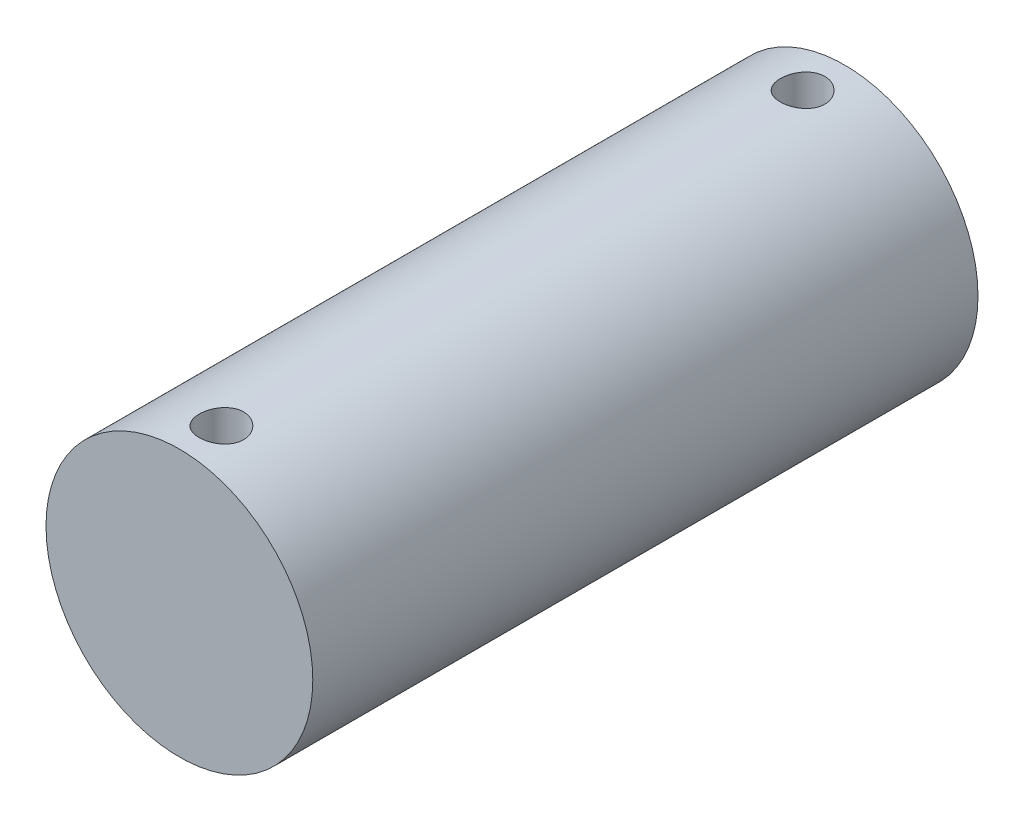
ISO-10303-21;
HEADER;
FILE_DESCRIPTION(('STEP AP214'),'2;1');
FILE_NAME('part.step','',(''),(''),'','','');
FILE_SCHEMA(('AUTOMOTIVE_DESIGN { 1 0 10303 214 1 1 1 1 }'));
ENDSEC;
DATA;
#1=APPLICATION_CONTEXT('core data for automotive mechanical design processes');
#2=APPLICATION_PROTOCOL_DEFINITION('international standard','automotive_design',2000,#1);
#3=PRODUCT_CONTEXT('',#1,'mechanical');
#4=PRODUCT('Part','Part','',(#3));
#5=PRODUCT_RELATED_PRODUCT_CATEGORY('part','',(#4));
#6=PRODUCT_DEFINITION_FORMATION('','',#4);
#7=PRODUCT_DEFINITION_CONTEXT('part definition',#1,'design');
#8=PRODUCT_DEFINITION('design','',#6,#7);
#9=PRODUCT_DEFINITION_SHAPE('','',#8);
#10=(LENGTH_UNIT() NAMED_UNIT(*) SI_UNIT(.MILLI.,.METRE.));
#11=(NAMED_UNIT(*) PLANE_ANGLE_UNIT() SI_UNIT($,.RADIAN.));
#12=(NAMED_UNIT(*) SI_UNIT($,.STERADIAN.) SOLID_ANGLE_UNIT());
#13=UNCERTAINTY_MEASURE_WITH_UNIT(LENGTH_MEASURE(1.E-05),#10,'distance_accuracy_value','');
#14=(GEOMETRIC_REPRESENTATION_CONTEXT(3) GLOBAL_UNCERTAINTY_ASSIGNED_CONTEXT((#13)) GLOBAL_UNIT_ASSIGNED_CONTEXT((#10,
#11,#12)) REPRESENTATION_CONTEXT('',''));
#15=CARTESIAN_POINT('',(0.,0.,0.));
#16=DIRECTION('',(0.,0.,1.));
#17=DIRECTION('',(1.,0.,0.));
#18=AXIS2_PLACEMENT_3D('',#15,#16,#17);
#19=CARTESIAN_POINT('',(0.,0.,95.));
#20=DIRECTION('',(0.,0.,-1.));
#21=DIRECTION('',(-1.,0.,0.));
#22=AXIS2_PLACEMENT_3D('',#19,#20,#21);
#23=CYLINDRICAL_SURFACE('',#22,19.05);
#24=CARTESIAN_POINT('',(0.,-19.05,92.175));
#25=CARTESIAN_POINT('',(0.177026449296933,-19.0499969668441,92.1749929020363));
#26=CARTESIAN_POINT('',(0.354149509935303,-19.0475067094955,92.1601444607895));
#27=CARTESIAN_POINT('',(0.703427881524764,-19.0378123807556,92.101167713368));
#28=CARTESIAN_POINT('',(0.875578472308241,-19.0306039748334,92.0570124827223));
#29=CARTESIAN_POINT('',(1.20980802896005,-19.0122818666029,91.9407923802872));
#30=CARTESIAN_POINT('',(1.37189510790851,-19.0011713595218,91.8687503386365));
#31=CARTESIAN_POINT('',(1.68166013931198,-18.9762666839423,91.6988613890935));
#32=CARTESIAN_POINT('',(1.8293397371458,-18.9624728224313,91.6010174325966));
#33=CARTESIAN_POINT('',(2.10753022015043,-18.9335831317206,91.381307043548));
#34=CARTESIAN_POINT('',(2.2378833874894,-18.9184771720487,91.2592422244121));
#35=CARTESIAN_POINT('',(2.4763583932981,-18.8887433613345,90.9949820800395));
#36=CARTESIAN_POINT('',(2.58447882822653,-18.8741155405259,90.8527854848501));
#37=CARTESIAN_POINT('',(2.77605124951852,-18.8468960851492,90.5512148729298));
#38=CARTESIAN_POINT('',(2.85934728213347,-18.8343175394638,90.391740502258));
#39=CARTESIAN_POINT('',(2.99790912407224,-18.8127613303924,90.0608188533382));
#40=CARTESIAN_POINT('',(3.05317682678832,-18.8037834237817,89.8893723847294));
#41=CARTESIAN_POINT('',(3.1336162597867,-18.790545817903,89.5410450509322));
#42=CARTESIAN_POINT('',(3.15906026700195,-18.7862434597684,89.3642287146432));
#43=CARTESIAN_POINT('',(3.17997424111814,-18.7827150244954,89.008788048358));
#44=CARTESIAN_POINT('',(3.17544632929402,-18.7834885881066,88.8301638472075));
#45=CARTESIAN_POINT('',(3.13676677496311,-18.7899856465671,88.4781216161802));
#46=CARTESIAN_POINT('',(3.10292100000001,-18.7956580311502,88.3046688994975));
#47=CARTESIAN_POINT('',(3.00704648831237,-18.8112335891798,87.965938926357));
#48=CARTESIAN_POINT('',(2.94501678498607,-18.8211369077305,87.8006619505115));
#49=CARTESIAN_POINT('',(2.79422510253927,-18.8441136875431,87.48205939423));
#50=CARTESIAN_POINT('',(2.70533611062724,-18.857202152263,87.3287950542769));
#51=CARTESIAN_POINT('',(2.50343926229794,-18.8850640638706,87.0392414113163));
#52=CARTESIAN_POINT('',(2.39042945923094,-18.8998376467094,86.9029534797822));
#53=CARTESIAN_POINT('',(2.141832409442,-18.9296297540733,86.6494508710247));
#54=CARTESIAN_POINT('',(2.00598273411888,-18.944649045242,86.5324934814541));
#55=CARTESIAN_POINT('',(1.7164497662067,-18.9730710377384,86.322995241415));
#56=CARTESIAN_POINT('',(1.56276635872116,-18.9864737286498,86.2304545482673));
#57=CARTESIAN_POINT('',(1.24168651353172,-19.01017143974,86.0723931715369));
#58=CARTESIAN_POINT('',(1.07427868146712,-19.0204638437746,86.0068952174493));
#59=CARTESIAN_POINT('',(0.730628898915469,-19.0367602882608,85.9050173466376));
#60=CARTESIAN_POINT('',(0.554387688757927,-19.042764687451,85.8686349940434));
#61=CARTESIAN_POINT('',(0.200291574653066,-19.0497603490021,85.8263698747544));
#62=CARTESIAN_POINT('',(0.0224799361817875,-19.0508096632624,85.8201339038069));
#63=CARTESIAN_POINT('',(-0.331647511570155,-19.0479359251489,85.8373969074237));
#64=CARTESIAN_POINT('',(-0.507963378142888,-19.0440130640963,85.8608947378798));
#65=CARTESIAN_POINT('',(-0.853003342944386,-19.0316717021152,85.9366645586561));
#66=CARTESIAN_POINT('',(-1.02176690284942,-19.0232805309766,85.9887616846555));
#67=CARTESIAN_POINT('',(-1.34816454377275,-19.0029396985831,86.1200648381134));
#68=CARTESIAN_POINT('',(-1.50579799920534,-18.9909898375027,86.1992723878968));
#69=CARTESIAN_POINT('',(-1.80699497562557,-18.9647133570406,86.3833569283649));
#70=CARTESIAN_POINT('',(-1.95042186869017,-18.9503666697652,86.4884545483324));
#71=CARTESIAN_POINT('',(-2.2177293535884,-18.9209485358771,86.721032390539));
#72=CARTESIAN_POINT('',(-2.34160852441465,-18.9058770366786,86.8485142385614));
#73=CARTESIAN_POINT('',(-2.56761333016565,-18.8765202254952,87.1238258860507));
#74=CARTESIAN_POINT('',(-2.66950032661441,-18.8622446749412,87.2718527902033));
#75=CARTESIAN_POINT('',(-2.84696193407463,-18.8362784281791,87.583128270806));
#76=CARTESIAN_POINT('',(-2.92253737915767,-18.8245876500385,87.7463763645389));
#77=CARTESIAN_POINT('',(-3.04487368097089,-18.8051878619608,88.0827929606714));
#78=CARTESIAN_POINT('',(-3.09175331933588,-18.7974624597505,88.2559172806887));
#79=CARTESIAN_POINT('',(-3.15574102629841,-18.7868270038078,88.6077225641116));
#80=CARTESIAN_POINT('',(-3.17285168317163,-18.7839165314406,88.7864030430597));
#81=CARTESIAN_POINT('',(-3.17674353988013,-18.7832585101669,89.1418655607723));
#82=CARTESIAN_POINT('',(-3.16390037287898,-18.7854470176218,89.3186434807906));
#83=CARTESIAN_POINT('',(-3.10906139547519,-18.7946002244623,89.6674856450245));
#84=CARTESIAN_POINT('',(-3.06706567956284,-18.8015649083674,89.8395499045162));
#85=CARTESIAN_POINT('',(-2.95525760178552,-18.8194614247778,90.1739352153616));
#86=CARTESIAN_POINT('',(-2.88547758006256,-18.8303886436898,90.3362673427712));
#87=CARTESIAN_POINT('',(-2.7201202949732,-18.854983485312,90.6469812998775));
#88=CARTESIAN_POINT('',(-2.62454175211067,-18.8686512439327,90.7953624371726));
#89=CARTESIAN_POINT('',(-2.40895998315263,-18.8973898663794,91.0758601905469));
#90=CARTESIAN_POINT('',(-2.28868041576392,-18.912475453819,91.2077629412094));
#91=CARTESIAN_POINT('',(-2.02769346985288,-18.9422325289827,91.4496415376832));
#92=CARTESIAN_POINT('',(-1.88698138339904,-18.9569039203371,91.5596123161705));
#93=CARTESIAN_POINT('',(-1.58796884544315,-18.9842969264562,91.7551993006139));
#94=CARTESIAN_POINT('',(-1.42955364016667,-18.9970043764144,91.8406420699275));
#95=CARTESIAN_POINT('',(-1.1004715981113,-19.0188998285425,91.9835722454546));
#96=CARTESIAN_POINT('',(-0.929817158434115,-19.028091333854,92.0410874929712));
#97=CARTESIAN_POINT('',(-0.632083203757663,-19.0399135435785,92.1140466981409));
#98=CARTESIAN_POINT('',(-0.50680471447903,-19.0436757463717,92.1368675764123));
#99=CARTESIAN_POINT('',(-0.254367424106157,-19.0487200430237,92.1673466470628));
#100=CARTESIAN_POINT('',(-0.127208655422787,-19.0500021795822,92.1750051004944));
#101=CARTESIAN_POINT('',(0.,-19.05,92.175));
#102=B_SPLINE_CURVE_WITH_KNOTS('',3,(#24,#25,#26,#27,#28,#29,#30,#31,#32,#33,#34,#35,#36,#37,
#38,#39,#40,#41,#42,#43,#44,#45,#46,#47,#48,#49,#50,#51,#52,#53,#54,#55,#56,#57,#58,#59,#60,#61,
#62,#63,#64,#65,#66,#67,#68,#69,#70,#71,#72,#73,#74,#75,#76,#77,#78,#79,#80,#81,#82,#83,#84,#85,
#86,#87,#88,#89,#90,#91,#92,#93,#94,#95,#96,#97,#98,#99,#100,#101),.UNSPECIFIED.,.T.,.F.,(4,2,2,
2,2,2,2,2,2,2,2,2,2,2,2,2,2,2,2,2,2,2,2,2,2,2,2,2,2,2,2,2,2,2,2,2,2,2,4),(0.,0.530614362871907,
1.06171688303318,1.59238552112208,2.12299348409697,2.65814163649162,3.19332356215717,
3.73180001446275,4.2702400863275,4.80372517921347,5.33717251487525,5.86512062635719,
6.39308684582233,6.92358986923347,7.45413572264327,7.99125617787382,8.52838009377526,
9.06595454923196,9.60348402541857,10.1347001203407,10.6658957755554,11.1938791489815,
11.721892174991,12.2545706854632,12.7872879007894,13.3255235394967,13.8637421146745,
14.3997174837405,14.93564624989,15.4648904509383,15.9941329365893,16.522761191473,
17.0514156688726,17.5863425792561,18.1213929402629,18.6601383414114,19.1983455520519,
19.579643951683,19.9609357864175),.UNSPECIFIED.);
#103=CARTESIAN_POINT('',(0.,-19.05,92.175));
#104=VERTEX_POINT('',#103);
#105=EDGE_CURVE('E35',#104,#104,#102,.T.);
#106=ORIENTED_EDGE('',*,*,#105,.T.);
#107=EDGE_LOOP('',(#106));
#108=FACE_BOUND('',#107,.T.);
#109=CARTESIAN_POINT('',(0.,19.05,92.175));
#110=CARTESIAN_POINT('',(-0.177026449296932,19.0499969668441,92.1749929020363));
#111=CARTESIAN_POINT('',(-0.354149509935302,19.0475067094955,92.1601444607895));
#112=CARTESIAN_POINT('',(-0.703427881524763,19.0378123807556,92.101167713368));
#113=CARTESIAN_POINT('',(-0.87557847230824,19.0306039748334,92.0570124827223));
#114=CARTESIAN_POINT('',(-1.20980802896005,19.0122818666029,91.9407923802872));
#115=CARTESIAN_POINT('',(-1.37189510790851,19.0011713595218,91.8687503386365));
#116=CARTESIAN_POINT('',(-1.68166013931198,18.9762666839423,91.6988613890935));
#117=CARTESIAN_POINT('',(-1.8293397371458,18.9624728224313,91.6010174325966));
#118=CARTESIAN_POINT('',(-2.10753022015042,18.9335831317206,91.381307043548));
#119=CARTESIAN_POINT('',(-2.2378833874894,18.9184771720487,91.2592422244121));
#120=CARTESIAN_POINT('',(-2.4763583932981,18.8887433613345,90.9949820800395));
#121=CARTESIAN_POINT('',(-2.58447882822653,18.8741155405259,90.8527854848501));
#122=CARTESIAN_POINT('',(-2.77605124951851,18.8468960851492,90.5512148729298));
#123=CARTESIAN_POINT('',(-2.85934728213346,18.8343175394638,90.391740502258));
#124=CARTESIAN_POINT('',(-2.99790912407224,18.8127613303924,90.0608188533382));
#125=CARTESIAN_POINT('',(-3.05317682678832,18.8037834237817,89.8893723847294));
#126=CARTESIAN_POINT('',(-3.1336162597867,18.790545817903,89.5410450509322));
#127=CARTESIAN_POINT('',(-3.15906026700195,18.7862434597684,89.3642287146432));
#128=CARTESIAN_POINT('',(-3.17997424111813,18.7827150244954,89.008788048358));
#129=CARTESIAN_POINT('',(-3.17544632929402,18.7834885881066,88.8301638472075));
#130=CARTESIAN_POINT('',(-3.13676677496311,18.7899856465671,88.4781216161802));
#131=CARTESIAN_POINT('',(-3.10292100000001,18.7956580311502,88.3046688994976));
#132=CARTESIAN_POINT('',(-3.00704648831237,18.8112335891798,87.965938926357));
#133=CARTESIAN_POINT('',(-2.94501678498607,18.8211369077305,87.8006619505116));
#134=CARTESIAN_POINT('',(-2.79422510253927,18.8441136875431,87.48205939423));
#135=CARTESIAN_POINT('',(-2.70533611062723,18.857202152263,87.3287950542769));
#136=CARTESIAN_POINT('',(-2.50343926229794,18.8850640638706,87.0392414113163));
#137=CARTESIAN_POINT('',(-2.39042945923094,18.8998376467094,86.9029534797822));
#138=CARTESIAN_POINT('',(-2.141832409442,18.9296297540733,86.6494508710247));
#139=CARTESIAN_POINT('',(-2.00598273411888,18.944649045242,86.5324934814541));
#140=CARTESIAN_POINT('',(-1.7164497662067,18.9730710377384,86.322995241415));
#141=CARTESIAN_POINT('',(-1.56276635872116,18.9864737286498,86.2304545482673));
#142=CARTESIAN_POINT('',(-1.24168651353172,19.01017143974,86.0723931715369));
#143=CARTESIAN_POINT('',(-1.07427868146712,19.0204638437746,86.0068952174493));
#144=CARTESIAN_POINT('',(-0.730628898915468,19.0367602882608,85.9050173466376));
#145=CARTESIAN_POINT('',(-0.554387688757925,19.042764687451,85.8686349940434));
#146=CARTESIAN_POINT('',(-0.200291574653065,19.0497603490021,85.8263698747544));
#147=CARTESIAN_POINT('',(-0.0224799361817862,19.0508096632624,85.8201339038069));
#148=CARTESIAN_POINT('',(0.331647511570157,19.0479359251489,85.8373969074237));
#149=CARTESIAN_POINT('',(0.50796337814289,19.0440130640963,85.8608947378798));
#150=CARTESIAN_POINT('',(0.853003342944388,19.0316717021152,85.9366645586561));
#151=CARTESIAN_POINT('',(1.02176690284943,19.0232805309766,85.9887616846555));
#152=CARTESIAN_POINT('',(1.34816454377276,19.0029396985831,86.1200648381134));
#153=CARTESIAN_POINT('',(1.50579799920534,18.9909898375027,86.1992723878968));
#154=CARTESIAN_POINT('',(1.80699497562557,18.9647133570406,86.3833569283649));
#155=CARTESIAN_POINT('',(1.95042186869017,18.9503666697652,86.4884545483324));
#156=CARTESIAN_POINT('',(2.21772935358841,18.9209485358771,86.721032390539));
#157=CARTESIAN_POINT('',(2.34160852441465,18.9058770366786,86.8485142385614));
#158=CARTESIAN_POINT('',(2.56761333016566,18.8765202254952,87.1238258860507));
#159=CARTESIAN_POINT('',(2.66950032661441,18.8622446749412,87.2718527902033));
#160=CARTESIAN_POINT('',(2.84696193407463,18.8362784281791,87.583128270806));
#161=CARTESIAN_POINT('',(2.92253737915767,18.8245876500385,87.7463763645389));
#162=CARTESIAN_POINT('',(3.04487368097089,18.8051878619608,88.0827929606714));
#163=CARTESIAN_POINT('',(3.09175331933589,18.7974624597505,88.2559172806887));
#164=CARTESIAN_POINT('',(3.15574102629841,18.7868270038078,88.6077225641116));
#165=CARTESIAN_POINT('',(3.17285168317163,18.7839165314406,88.7864030430597));
#166=CARTESIAN_POINT('',(3.17674353988013,18.7832585101669,89.1418655607723));
#167=CARTESIAN_POINT('',(3.16390037287898,18.7854470176218,89.3186434807906));
#168=CARTESIAN_POINT('',(3.10906139547519,18.7946002244623,89.6674856450245));
#169=CARTESIAN_POINT('',(3.06706567956284,18.8015649083674,89.8395499045162));
#170=CARTESIAN_POINT('',(2.95525760178552,18.8194614247778,90.1739352153616));
#171=CARTESIAN_POINT('',(2.88547758006256,18.8303886436898,90.3362673427712));
#172=CARTESIAN_POINT('',(2.7201202949732,18.854983485312,90.6469812998775));
#173=CARTESIAN_POINT('',(2.62454175211067,18.8686512439327,90.7953624371726));
#174=CARTESIAN_POINT('',(2.40895998315263,18.8973898663794,91.0758601905469));
#175=CARTESIAN_POINT('',(2.28868041576392,18.912475453819,91.2077629412094));
#176=CARTESIAN_POINT('',(2.02769346985288,18.9422325289827,91.4496415376832));
#177=CARTESIAN_POINT('',(1.88698138339904,18.9569039203371,91.5596123161705));
#178=CARTESIAN_POINT('',(1.58796884544315,18.9842969264562,91.7551993006139));
#179=CARTESIAN_POINT('',(1.42955364016667,18.9970043764144,91.8406420699275));
#180=CARTESIAN_POINT('',(1.10047159811131,19.0188998285425,91.9835722454546));
#181=CARTESIAN_POINT('',(0.929817158434116,19.028091333854,92.0410874929712));
#182=CARTESIAN_POINT('',(0.632083203757664,19.0399135435785,92.1140466981409));
#183=CARTESIAN_POINT('',(0.506804714479031,19.0436757463717,92.1368675764123));
#184=CARTESIAN_POINT('',(0.254367424106159,19.0487200430237,92.1673466470628));
#185=CARTESIAN_POINT('',(0.127208655422789,19.0500021795822,92.1750051004944));
#186=CARTESIAN_POINT('',(0.,19.05,92.175));
#187=B_SPLINE_CURVE_WITH_KNOTS('',3,(#109,#110,#111,#112,#113,#114,#115,#116,#117,#118,#119,
#120,#121,#122,#123,#124,#125,#126,#127,#128,#129,#130,#131,#132,#133,#134,#135,#136,#137,#138,
#139,#140,#141,#142,#143,#144,#145,#146,#147,#148,#149,#150,#151,#152,#153,#154,#155,#156,#157,
#158,#159,#160,#161,#162,#163,#164,#165,#166,#167,#168,#169,#170,#171,#172,#173,#174,#175,#176,
#177,#178,#179,#180,#181,#182,#183,#184,#185,#186),.UNSPECIFIED.,.T.,.F.,(4,2,2,2,2,2,2,2,2,2,2,
2,2,2,2,2,2,2,2,2,2,2,2,2,2,2,2,2,2,2,2,2,2,2,2,2,2,2,4),(0.,0.530614362871907,1.06171688303318,
1.59238552112208,2.12299348409697,2.65814163649161,3.19332356215717,3.73180001446275,
4.2702400863275,4.80372517921348,5.33717251487525,5.86512062635717,6.39308684582233,
6.92358986923347,7.45413572264327,7.99125617787382,8.52838009377526,9.06595454923196,
9.60348402541857,10.1347001203407,10.6658957755554,11.1938791489815,11.721892174991,
12.2545706854632,12.7872879007894,13.3255235394967,13.8637421146745,14.3997174837405,
14.93564624989,15.4648904509383,15.9941329365893,16.522761191473,17.0514156688726,
17.5863425792561,18.1213929402629,18.6601383414114,19.1983455520519,19.579643951683,
19.9609357864175),.UNSPECIFIED.);
#188=CARTESIAN_POINT('',(0.,19.05,92.175));
#189=VERTEX_POINT('',#188);
#190=EDGE_CURVE('E84',#189,#189,#187,.T.);
#191=ORIENTED_EDGE('',*,*,#190,.T.);
#192=EDGE_LOOP('',(#191));
#193=FACE_BOUND('',#192,.T.);
#194=CARTESIAN_POINT('',(0.,-19.05,9.175));
#195=CARTESIAN_POINT('',(0.177026449296933,-19.0499969668441,9.17499290203627));
#196=CARTESIAN_POINT('',(0.354149509935303,-19.0475067094955,9.16014446078947));
#197=CARTESIAN_POINT('',(0.703427881524765,-19.0378123807556,9.10116771336804));
#198=CARTESIAN_POINT('',(0.875578472308244,-19.0306039748334,9.05701248272226));
#199=CARTESIAN_POINT('',(1.20980802896006,-19.0122818666029,8.9407923802872));
#200=CARTESIAN_POINT('',(1.37189510790851,-19.0011713595218,8.86875033863647));
#201=CARTESIAN_POINT('',(1.68166013931199,-18.9762666839423,8.69886138909346));
#202=CARTESIAN_POINT('',(1.82933973714581,-18.9624728224313,8.60101743259659));
#203=CARTESIAN_POINT('',(2.10753022015043,-18.9335831317206,8.38130704354802));
#204=CARTESIAN_POINT('',(2.23788338748941,-18.9184771720487,8.25924222441212));
#205=CARTESIAN_POINT('',(2.47635839329811,-18.8887433613345,7.99498208003953));
#206=CARTESIAN_POINT('',(2.58447882822653,-18.8741155405259,7.8527854848501));
#207=CARTESIAN_POINT('',(2.77605124951852,-18.8468960851492,7.55121487292974));
#208=CARTESIAN_POINT('',(2.85934728213347,-18.8343175394638,7.39174050225796));
#209=CARTESIAN_POINT('',(2.99790912407225,-18.8127613303924,7.06081885333821));
#210=CARTESIAN_POINT('',(3.05317682678833,-18.8037834237817,6.88937238472941));
#211=CARTESIAN_POINT('',(3.13361625978671,-18.790545817903,6.5410450509322));
#212=CARTESIAN_POINT('',(3.15906026700196,-18.7862434597684,6.36422871464323));
#213=CARTESIAN_POINT('',(3.17997424111814,-18.7827150244954,6.00878804835799));
#214=CARTESIAN_POINT('',(3.17544632929403,-18.7834885881066,5.83016384720753));
#215=CARTESIAN_POINT('',(3.13676677496311,-18.7899856465671,5.47812161618018));
#216=CARTESIAN_POINT('',(3.10292100000001,-18.7956580311502,5.30466889949756));
#217=CARTESIAN_POINT('',(3.00704648831238,-18.8112335891798,4.965938926357));
#218=CARTESIAN_POINT('',(2.94501678498607,-18.8211369077305,4.80066195051155));
#219=CARTESIAN_POINT('',(2.79422510253927,-18.8441136875431,4.48205939423003));
#220=CARTESIAN_POINT('',(2.70533611062724,-18.857202152263,4.32879505427684));
#221=CARTESIAN_POINT('',(2.50343926229794,-18.8850640638706,4.03924141131625));
#222=CARTESIAN_POINT('',(2.39042945923095,-18.8998376467094,3.90295347978224));
#223=CARTESIAN_POINT('',(2.141832409442,-18.9296297540733,3.64945087102467));
#224=CARTESIAN_POINT('',(2.00598273411887,-18.944649045242,3.5324934814541));
#225=CARTESIAN_POINT('',(1.71644976620669,-18.9730710377384,3.32299524141502));
#226=CARTESIAN_POINT('',(1.56276635872116,-18.9864737286498,3.2304545482673));
#227=CARTESIAN_POINT('',(1.24168651353172,-19.01017143974,3.07239317153692));
#228=CARTESIAN_POINT('',(1.07427868146712,-19.0204638437746,3.0068952174493));
#229=CARTESIAN_POINT('',(0.730628898915469,-19.0367602882608,2.90501734663761));
#230=CARTESIAN_POINT('',(0.554387688757926,-19.042764687451,2.86863499404338));
#231=CARTESIAN_POINT('',(0.200291574653064,-19.0497603490021,2.82636987475436));
#232=CARTESIAN_POINT('',(0.0224799361817855,-19.0508096632624,2.82013390380688));
#233=CARTESIAN_POINT('',(-0.331647511570156,-19.0479359251489,2.83739690742372));
#234=CARTESIAN_POINT('',(-0.507963378142888,-19.0440130640963,2.86089473787984));
#235=CARTESIAN_POINT('',(-0.853003342944388,-19.0316717021152,2.93666455865606));
#236=CARTESIAN_POINT('',(-1.02176690284943,-19.0232805309766,2.98876168465546));
#237=CARTESIAN_POINT('',(-1.34816454377276,-19.0029396985831,3.12006483811341));
#238=CARTESIAN_POINT('',(-1.50579799920534,-18.9909898375027,3.1992723878968));
#239=CARTESIAN_POINT('',(-1.80699497562558,-18.9647133570406,3.38335692836492));
#240=CARTESIAN_POINT('',(-1.95042186869018,-18.9503666697652,3.48845454833241));
#241=CARTESIAN_POINT('',(-2.21772935358841,-18.9209485358771,3.72103239053903));
#242=CARTESIAN_POINT('',(-2.34160852441466,-18.9058770366786,3.84851423856137));
#243=CARTESIAN_POINT('',(-2.56761333016566,-18.8765202254952,4.12382588605071));
#244=CARTESIAN_POINT('',(-2.66950032661442,-18.8622446749412,4.2718527902033));
#245=CARTESIAN_POINT('',(-2.84696193407463,-18.8362784281791,4.58312827080594));
#246=CARTESIAN_POINT('',(-2.92253737915767,-18.8245876500385,4.74637636453892));
#247=CARTESIAN_POINT('',(-3.0448736809709,-18.8051878619608,5.08279296067141));
#248=CARTESIAN_POINT('',(-3.09175331933589,-18.7974624597505,5.25591728068872));
#249=CARTESIAN_POINT('',(-3.15574102629841,-18.7868270038078,5.60772256411164));
#250=CARTESIAN_POINT('',(-3.17285168317163,-18.7839165314406,5.78640304305971));
#251=CARTESIAN_POINT('',(-3.17674353988014,-18.7832585101669,6.14186556077226));
#252=CARTESIAN_POINT('',(-3.16390037287899,-18.7854470176218,6.31864348079062));
#253=CARTESIAN_POINT('',(-3.1090613954752,-18.7946002244623,6.66748564502447));
#254=CARTESIAN_POINT('',(-3.06706567956284,-18.8015649083674,6.83954990451618));
#255=CARTESIAN_POINT('',(-2.95525760178552,-18.8194614247778,7.17393521536162));
#256=CARTESIAN_POINT('',(-2.88547758006256,-18.8303886436898,7.33626734277115));
#257=CARTESIAN_POINT('',(-2.7201202949732,-18.854983485312,7.64698129987745));
#258=CARTESIAN_POINT('',(-2.62454175211067,-18.8686512439327,7.79536243717261));
#259=CARTESIAN_POINT('',(-2.40895998315264,-18.8973898663794,8.07586019054685));
#260=CARTESIAN_POINT('',(-2.28868041576393,-18.912475453819,8.20776294120935));
#261=CARTESIAN_POINT('',(-2.02769346985289,-18.9422325289827,8.44964153768317));
#262=CARTESIAN_POINT('',(-1.88698138339905,-18.9569039203371,8.55961231617048));
#263=CARTESIAN_POINT('',(-1.58796884544316,-18.9842969264562,8.75519930061393));
#264=CARTESIAN_POINT('',(-1.42955364016668,-18.9970043764144,8.84064206992745));
#265=CARTESIAN_POINT('',(-1.10047159811131,-19.0188998285425,8.9835722454546));
#266=CARTESIAN_POINT('',(-0.929817158434115,-19.028091333854,9.04108749297122));
#267=CARTESIAN_POINT('',(-0.632083203757659,-19.0399135435785,9.11404669814086));
#268=CARTESIAN_POINT('',(-0.506804714479028,-19.0436757463717,9.13686757641227));
#269=CARTESIAN_POINT('',(-0.254367424106156,-19.0487200430237,9.16734664706284));
#270=CARTESIAN_POINT('',(-0.127208655422787,-19.0500021795822,9.17500510049445));
#271=CARTESIAN_POINT('',(0.,-19.05,9.175));
#272=B_SPLINE_CURVE_WITH_KNOTS('',3,(#194,#195,#196,#197,#198,#199,#200,#201,#202,#203,#204,
#205,#206,#207,#208,#209,#210,#211,#212,#213,#214,#215,#216,#217,#218,#219,#220,#221,#222,#223,
#224,#225,#226,#227,#228,#229,#230,#231,#232,#233,#234,#235,#236,#237,#238,#239,#240,#241,#242,
#243,#244,#245,#246,#247,#248,#249,#250,#251,#252,#253,#254,#255,#256,#257,#258,#259,#260,#261,
#262,#263,#264,#265,#266,#267,#268,#269,#270,#271),.UNSPECIFIED.,.T.,.F.,(4,2,2,2,2,2,2,2,2,2,2,
2,2,2,2,2,2,2,2,2,2,2,2,2,2,2,2,2,2,2,2,2,2,2,2,2,2,2,4),(0.,0.530614362871907,1.06171688303318,
1.59238552112209,2.12299348409698,2.65814163649162,3.19332356215718,3.73180001446277,
4.2702400863275,4.80372517921348,5.33717251487526,5.86512062635719,6.39308684582234,
6.92358986923348,7.45413572264328,7.99125617787385,8.52838009377526,9.06595454923197,
9.60348402541859,10.1347001203407,10.6658957755554,11.1938791489815,11.721892174991,
12.2545706854632,12.7872879007894,13.3255235394968,13.8637421146745,14.3997174837405,
14.93564624989,15.4648904509383,15.9941329365893,16.522761191473,17.0514156688726,
17.5863425792561,18.121392940263,18.6601383414114,19.1983455520519,19.579643951683,
19.9609357864175),.UNSPECIFIED.);
#273=CARTESIAN_POINT('',(0.,-19.05,9.175));
#274=VERTEX_POINT('',#273);
#275=EDGE_CURVE('E47',#274,#274,#272,.T.);
#276=ORIENTED_EDGE('',*,*,#275,.T.);
#277=EDGE_LOOP('',(#276));
#278=FACE_BOUND('',#277,.T.);
#279=CARTESIAN_POINT('',(0.,19.05,9.175));
#280=CARTESIAN_POINT('',(-0.177026449296932,19.0499969668441,9.17499290203627));
#281=CARTESIAN_POINT('',(-0.354149509935302,19.0475067094955,9.16014446078947));
#282=CARTESIAN_POINT('',(-0.703427881524763,19.0378123807556,9.10116771336804));
#283=CARTESIAN_POINT('',(-0.875578472308242,19.0306039748334,9.05701248272226));
#284=CARTESIAN_POINT('',(-1.20980802896006,19.0122818666029,8.9407923802872));
#285=CARTESIAN_POINT('',(-1.37189510790851,19.0011713595218,8.86875033863647));
#286=CARTESIAN_POINT('',(-1.68166013931199,18.9762666839423,8.69886138909346));
#287=CARTESIAN_POINT('',(-1.82933973714581,18.9624728224313,8.60101743259659));
#288=CARTESIAN_POINT('',(-2.10753022015043,18.9335831317206,8.38130704354802));
#289=CARTESIAN_POINT('',(-2.23788338748941,18.9184771720487,8.25924222441212));
#290=CARTESIAN_POINT('',(-2.47635839329811,18.8887433613345,7.99498208003953));
#291=CARTESIAN_POINT('',(-2.58447882822653,18.8741155405259,7.85278548485011));
#292=CARTESIAN_POINT('',(-2.77605124951852,18.8468960851492,7.55121487292974));
#293=CARTESIAN_POINT('',(-2.85934728213347,18.8343175394638,7.39174050225796));
#294=CARTESIAN_POINT('',(-2.99790912407225,18.8127613303924,7.06081885333821));
#295=CARTESIAN_POINT('',(-3.05317682678833,18.8037834237817,6.88937238472941));
#296=CARTESIAN_POINT('',(-3.1336162597867,18.790545817903,6.5410450509322));
#297=CARTESIAN_POINT('',(-3.15906026700196,18.7862434597684,6.36422871464323));
#298=CARTESIAN_POINT('',(-3.17997424111814,18.7827150244954,6.00878804835799));
#299=CARTESIAN_POINT('',(-3.17544632929402,18.7834885881066,5.83016384720753));
#300=CARTESIAN_POINT('',(-3.13676677496311,18.7899856465671,5.47812161618018));
#301=CARTESIAN_POINT('',(-3.10292100000001,18.7956580311502,5.30466889949755));
#302=CARTESIAN_POINT('',(-3.00704648831237,18.8112335891798,4.965938926357));
#303=CARTESIAN_POINT('',(-2.94501678498607,18.8211369077305,4.80066195051155));
#304=CARTESIAN_POINT('',(-2.79422510253927,18.8441136875431,4.48205939423003));
#305=CARTESIAN_POINT('',(-2.70533611062724,18.857202152263,4.32879505427684));
#306=CARTESIAN_POINT('',(-2.50343926229794,18.8850640638706,4.03924141131625));
#307=CARTESIAN_POINT('',(-2.39042945923094,18.8998376467094,3.90295347978224));
#308=CARTESIAN_POINT('',(-2.141832409442,18.9296297540733,3.64945087102467));
#309=CARTESIAN_POINT('',(-2.00598273411887,18.944649045242,3.5324934814541));
#310=CARTESIAN_POINT('',(-1.71644976620669,18.9730710377384,3.32299524141502));
#311=CARTESIAN_POINT('',(-1.56276635872115,18.9864737286498,3.2304545482673));
#312=CARTESIAN_POINT('',(-1.24168651353172,19.01017143974,3.07239317153692));
#313=CARTESIAN_POINT('',(-1.07427868146712,19.0204638437746,3.0068952174493));
#314=CARTESIAN_POINT('',(-0.730628898915468,19.0367602882608,2.90501734663761));
#315=CARTESIAN_POINT('',(-0.554387688757924,19.042764687451,2.86863499404338));
#316=CARTESIAN_POINT('',(-0.200291574653062,19.0497603490021,2.82636987475436));
#317=CARTESIAN_POINT('',(-0.0224799361817847,19.0508096632624,2.82013390380688));
#318=CARTESIAN_POINT('',(0.331647511570157,19.0479359251489,2.83739690742372));
#319=CARTESIAN_POINT('',(0.507963378142889,19.0440130640963,2.86089473787984));
#320=CARTESIAN_POINT('',(0.85300334294439,19.0316717021152,2.93666455865606));
#321=CARTESIAN_POINT('',(1.02176690284943,19.0232805309766,2.98876168465546));
#322=CARTESIAN_POINT('',(1.34816454377276,19.0029396985831,3.12006483811341));
#323=CARTESIAN_POINT('',(1.50579799920534,18.9909898375027,3.1992723878968));
#324=CARTESIAN_POINT('',(1.80699497562558,18.9647133570406,3.38335692836492));
#325=CARTESIAN_POINT('',(1.95042186869018,18.9503666697652,3.48845454833241));
#326=CARTESIAN_POINT('',(2.21772935358841,18.9209485358771,3.72103239053902));
#327=CARTESIAN_POINT('',(2.34160852441466,18.9058770366786,3.84851423856137));
#328=CARTESIAN_POINT('',(2.56761333016566,18.8765202254952,4.12382588605071));
#329=CARTESIAN_POINT('',(2.66950032661442,18.8622446749412,4.2718527902033));
#330=CARTESIAN_POINT('',(2.84696193407463,18.8362784281791,4.58312827080594));
#331=CARTESIAN_POINT('',(2.92253737915767,18.8245876500385,4.74637636453892));
#332=CARTESIAN_POINT('',(3.0448736809709,18.8051878619608,5.08279296067141));
#333=CARTESIAN_POINT('',(3.09175331933589,18.7974624597505,5.25591728068872));
#334=CARTESIAN_POINT('',(3.15574102629841,18.7868270038078,5.60772256411164));
#335=CARTESIAN_POINT('',(3.17285168317163,18.7839165314406,5.78640304305971));
#336=CARTESIAN_POINT('',(3.17674353988014,18.7832585101669,6.14186556077226));
#337=CARTESIAN_POINT('',(3.16390037287899,18.7854470176218,6.31864348079062));
#338=CARTESIAN_POINT('',(3.1090613954752,18.7946002244623,6.66748564502447));
#339=CARTESIAN_POINT('',(3.06706567956285,18.8015649083674,6.83954990451618));
#340=CARTESIAN_POINT('',(2.95525760178553,18.8194614247778,7.17393521536162));
#341=CARTESIAN_POINT('',(2.88547758006256,18.8303886436898,7.33626734277115));
#342=CARTESIAN_POINT('',(2.72012029497321,18.854983485312,7.64698129987745));
#343=CARTESIAN_POINT('',(2.62454175211068,18.8686512439327,7.79536243717261));
#344=CARTESIAN_POINT('',(2.40895998315264,18.8973898663794,8.07586019054685));
#345=CARTESIAN_POINT('',(2.28868041576394,18.912475453819,8.20776294120935));
#346=CARTESIAN_POINT('',(2.02769346985289,18.9422325289827,8.44964153768317));
#347=CARTESIAN_POINT('',(1.88698138339905,18.9569039203371,8.55961231617048));
#348=CARTESIAN_POINT('',(1.58796884544316,18.9842969264562,8.75519930061393));
#349=CARTESIAN_POINT('',(1.42955364016668,18.9970043764144,8.84064206992745));
#350=CARTESIAN_POINT('',(1.10047159811131,19.0188998285425,8.9835722454546));
#351=CARTESIAN_POINT('',(0.929817158434113,19.028091333854,9.04108749297122));
#352=CARTESIAN_POINT('',(0.632083203757659,19.0399135435785,9.11404669814086));
#353=CARTESIAN_POINT('',(0.506804714479029,19.0436757463717,9.13686757641227));
#354=CARTESIAN_POINT('',(0.254367424106158,19.0487200430237,9.16734664706284));
#355=CARTESIAN_POINT('',(0.127208655422788,19.0500021795822,9.17500510049445));
#356=CARTESIAN_POINT('',(0.,19.05,9.175));
#357=B_SPLINE_CURVE_WITH_KNOTS('',3,(#279,#280,#281,#282,#283,#284,#285,#286,#287,#288,#289,
#290,#291,#292,#293,#294,#295,#296,#297,#298,#299,#300,#301,#302,#303,#304,#305,#306,#307,#308,
#309,#310,#311,#312,#313,#314,#315,#316,#317,#318,#319,#320,#321,#322,#323,#324,#325,#326,#327,
#328,#329,#330,#331,#332,#333,#334,#335,#336,#337,#338,#339,#340,#341,#342,#343,#344,#345,#346,
#347,#348,#349,#350,#351,#352,#353,#354,#355,#356),.UNSPECIFIED.,.T.,.F.,(4,2,2,2,2,2,2,2,2,2,2,
2,2,2,2,2,2,2,2,2,2,2,2,2,2,2,2,2,2,2,2,2,2,2,2,2,2,2,4),(0.,0.530614362871907,1.06171688303318,
1.59238552112209,2.12299348409698,2.65814163649162,3.19332356215718,3.73180001446277,
4.2702400863275,4.80372517921348,5.33717251487526,5.86512062635719,6.39308684582234,
6.92358986923348,7.45413572264328,7.99125617787385,8.52838009377526,9.06595454923197,
9.60348402541859,10.1347001203407,10.6658957755554,11.1938791489815,11.721892174991,
12.2545706854632,12.7872879007894,13.3255235394968,13.8637421146745,14.3997174837405,
14.93564624989,15.4648904509383,15.9941329365893,16.522761191473,17.0514156688726,
17.5863425792561,18.121392940263,18.6601383414114,19.1983455520519,19.579643951683,
19.9609357864175),.UNSPECIFIED.);
#358=CARTESIAN_POINT('',(0.,19.05,9.175));
#359=VERTEX_POINT('',#358);
#360=EDGE_CURVE('E50',#359,#359,#357,.T.);
#361=ORIENTED_EDGE('',*,*,#360,.T.);
#362=EDGE_LOOP('',(#361));
#363=FACE_BOUND('',#362,.T.);
#364=CARTESIAN_POINT('',(0.,0.,95.));
#365=DIRECTION('',(0.,0.,1.));
#366=DIRECTION('',(1.,0.,0.));
#367=AXIS2_PLACEMENT_3D('',#364,#365,#366);
#368=CIRCLE('',#367,19.05);
#369=CARTESIAN_POINT('',(19.05,0.,95.));
#370=VERTEX_POINT('',#369);
#371=EDGE_CURVE('E10',#370,#370,#368,.T.);
#372=ORIENTED_EDGE('',*,*,#371,.F.);
#373=EDGE_LOOP('',(#372));
#374=FACE_BOUND('',#373,.T.);
#375=CARTESIAN_POINT('',(0.,0.,0.));
#376=DIRECTION('',(0.,0.,1.));
#377=DIRECTION('',(1.,0.,0.));
#378=AXIS2_PLACEMENT_3D('',#375,#376,#377);
#379=CIRCLE('',#378,19.05);
#380=CARTESIAN_POINT('',(19.05,0.,0.));
#381=VERTEX_POINT('',#380);
#382=EDGE_CURVE('E42',#381,#381,#379,.T.);
#383=ORIENTED_EDGE('',*,*,#382,.T.);
#384=EDGE_LOOP('',(#383));
#385=FACE_BOUND('',#384,.T.);
#386=ADVANCED_FACE('F31',(#108,#193,#278,#363,#374,#385),#23,.T.);
#387=CARTESIAN_POINT('',(0.,0.,95.));
#388=DIRECTION('',(0.,0.,1.));
#389=DIRECTION('',(1.,0.,0.));
#390=AXIS2_PLACEMENT_3D('',#387,#388,#389);
#391=PLANE('',#390);
#392=ORIENTED_EDGE('',*,*,#371,.T.);
#393=EDGE_LOOP('',(#392));
#394=FACE_BOUND('',#393,.T.);
#395=ADVANCED_FACE('F66',(#394),#391,.T.);
#396=CARTESIAN_POINT('',(0.,0.,0.));
#397=DIRECTION('',(0.,0.,1.));
#398=DIRECTION('',(1.,0.,0.));
#399=AXIS2_PLACEMENT_3D('',#396,#397,#398);
#400=PLANE('',#399);
#401=ORIENTED_EDGE('',*,*,#382,.F.);
#402=EDGE_LOOP('',(#401));
#403=FACE_BOUND('',#402,.T.);
#404=ADVANCED_FACE('F63',(#403),#400,.F.);
#405=CARTESIAN_POINT('',(0.,-35.,6.));
#406=DIRECTION('',(0.,1.,0.));
#407=DIRECTION('',(0.,0.,1.));
#408=AXIS2_PLACEMENT_3D('',#405,#406,#407);
#409=CYLINDRICAL_SURFACE('',#408,3.175);
#410=ORIENTED_EDGE('',*,*,#360,.F.);
#411=EDGE_LOOP('',(#410));
#412=FACE_BOUND('',#411,.T.);
#413=ORIENTED_EDGE('',*,*,#275,.F.);
#414=EDGE_LOOP('',(#413));
#415=FACE_BOUND('',#414,.T.);
#416=ADVANCED_FACE('F58',(#412,#415),#409,.F.);
#417=CARTESIAN_POINT('',(0.,-35.,89.));
#418=DIRECTION('',(0.,1.,0.));
#419=DIRECTION('',(0.,0.,1.));
#420=AXIS2_PLACEMENT_3D('',#417,#418,#419);
#421=CYLINDRICAL_SURFACE('',#420,3.17499999999999);
#422=ORIENTED_EDGE('',*,*,#190,.F.);
#423=EDGE_LOOP('',(#422));
#424=FACE_BOUND('',#423,.T.);
#425=ORIENTED_EDGE('',*,*,#105,.F.);
#426=EDGE_LOOP('',(#425));
#427=FACE_BOUND('',#426,.T.);
#428=ADVANCED_FACE('F62',(#424,#427),#421,.F.);
#429=CLOSED_SHELL('',(#386,#395,#404,#416,#428));
#430=MANIFOLD_SOLID_BREP('B2',#429);
#431=ADVANCED_BREP_SHAPE_REPRESENTATION('',(#18,#430),#14);
#432=SHAPE_DEFINITION_REPRESENTATION(#9,#431);
ENDSEC;
END-ISO-10303-21;
